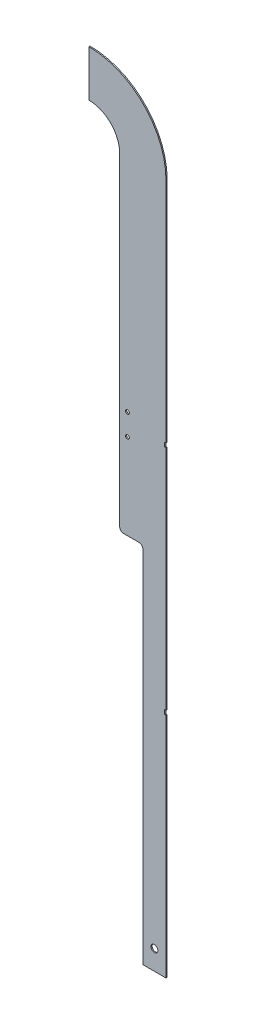
ISO-10303-21;
HEADER;
FILE_DESCRIPTION(('STEP AP214'),'2;1');
FILE_NAME('part.step','',(''),(''),'','','');
FILE_SCHEMA(('AUTOMOTIVE_DESIGN { 1 0 10303 214 1 1 1 1 }'));
ENDSEC;
DATA;
#1=APPLICATION_CONTEXT('core data for automotive mechanical design processes');
#2=APPLICATION_PROTOCOL_DEFINITION('international standard','automotive_design',2000,#1);
#3=PRODUCT_CONTEXT('',#1,'mechanical');
#4=PRODUCT('Part','Part','',(#3));
#5=PRODUCT_RELATED_PRODUCT_CATEGORY('part','',(#4));
#6=PRODUCT_DEFINITION_FORMATION('','',#4);
#7=PRODUCT_DEFINITION_CONTEXT('part definition',#1,'design');
#8=PRODUCT_DEFINITION('design','',#6,#7);
#9=PRODUCT_DEFINITION_SHAPE('','',#8);
#10=(LENGTH_UNIT() NAMED_UNIT(*) SI_UNIT(.MILLI.,.METRE.));
#11=(NAMED_UNIT(*) PLANE_ANGLE_UNIT() SI_UNIT($,.RADIAN.));
#12=(NAMED_UNIT(*) SI_UNIT($,.STERADIAN.) SOLID_ANGLE_UNIT());
#13=UNCERTAINTY_MEASURE_WITH_UNIT(LENGTH_MEASURE(1.E-05),#10,'distance_accuracy_value','');
#14=(GEOMETRIC_REPRESENTATION_CONTEXT(3) GLOBAL_UNCERTAINTY_ASSIGNED_CONTEXT((#13)) GLOBAL_UNIT_ASSIGNED_CONTEXT((#10,
#11,#12)) REPRESENTATION_CONTEXT('',''));
#15=CARTESIAN_POINT('',(0.,0.,0.));
#16=DIRECTION('',(0.,0.,1.));
#17=DIRECTION('',(1.,0.,0.));
#18=AXIS2_PLACEMENT_3D('',#15,#16,#17);
#19=CARTESIAN_POINT('',(265.75,440.,1.5));
#20=DIRECTION('',(0.,0.,1.));
#21=DIRECTION('',(1.,0.,0.));
#22=AXIS2_PLACEMENT_3D('',#19,#20,#21);
#23=PLANE('',#22);
#24=CARTESIAN_POINT('',(350.75,-470.,1.5));
#25=DIRECTION('',(0.,0.,-1.));
#26=DIRECTION('',(-1.,0.,0.));
#27=AXIS2_PLACEMENT_3D('',#24,#25,#26);
#28=CIRCLE('',#27,4.5);
#29=CARTESIAN_POINT('',(346.25,-470.,1.5));
#30=VERTEX_POINT('',#29);
#31=EDGE_CURVE('E283',#30,#30,#28,.T.);
#32=ORIENTED_EDGE('',*,*,#31,.T.);
#33=EDGE_LOOP('',(#32));
#34=FACE_BOUND('',#33,.T.);
#35=CARTESIAN_POINT('',(315.75,87.0000000000004,1.5));
#36=DIRECTION('',(0.,0.,-1.));
#37=DIRECTION('',(-1.,0.,0.));
#38=AXIS2_PLACEMENT_3D('',#35,#36,#37);
#39=CIRCLE('',#38,2.49999999999995);
#40=CARTESIAN_POINT('',(313.25,87.0000000000004,1.5));
#41=VERTEX_POINT('',#40);
#42=EDGE_CURVE('E268',#41,#41,#39,.T.);
#43=ORIENTED_EDGE('',*,*,#42,.T.);
#44=EDGE_LOOP('',(#43));
#45=FACE_BOUND('',#44,.T.);
#46=CARTESIAN_POINT('',(315.75,115.,1.5));
#47=DIRECTION('',(0.,0.,-1.));
#48=DIRECTION('',(-1.,0.,0.));
#49=AXIS2_PLACEMENT_3D('',#46,#47,#48);
#50=CIRCLE('',#49,2.49999999999995);
#51=CARTESIAN_POINT('',(313.25,115.,1.5));
#52=VERTEX_POINT('',#51);
#53=EDGE_CURVE('E252',#52,#52,#50,.T.);
#54=ORIENTED_EDGE('',*,*,#53,.T.);
#55=EDGE_LOOP('',(#54));
#56=FACE_BOUND('',#55,.T.);
#57=DIRECTION('',(0.,-1.,0.));
#58=VECTOR('',#57,1.);
#59=CARTESIAN_POINT('',(364.05,105.033333333333,1.5));
#60=LINE('',#59,#58);
#61=CARTESIAN_POINT('',(364.05,105.033333333333,1.5));
#62=VERTEX_POINT('',#61);
#63=CARTESIAN_POINT('',(364.05,99.6333333333334,1.5));
#64=VERTEX_POINT('',#63);
#65=EDGE_CURVE('E213',#62,#64,#60,.T.);
#66=ORIENTED_EDGE('',*,*,#65,.F.);
#67=DIRECTION('',(-1.,0.,0.));
#68=VECTOR('',#67,1.);
#69=CARTESIAN_POINT('',(365.95,105.033333333333,1.5));
#70=LINE('',#69,#68);
#71=CARTESIAN_POINT('',(365.75,105.033333333333,1.5));
#72=VERTEX_POINT('',#71);
#73=EDGE_CURVE('E198',#72,#62,#70,.T.);
#74=ORIENTED_EDGE('',*,*,#73,.F.);
#75=DIRECTION('',(0.,1.,0.));
#76=VECTOR('',#75,1.);
#77=CARTESIAN_POINT('',(365.75,500.,1.5));
#78=LINE('',#77,#76);
#79=CARTESIAN_POINT('',(365.75,400.,1.5));
#80=VERTEX_POINT('',#79);
#81=EDGE_CURVE('E263',#72,#80,#78,.T.);
#82=ORIENTED_EDGE('',*,*,#81,.T.);
#83=CARTESIAN_POINT('',(265.75,400.,1.5));
#84=DIRECTION('',(0.,0.,1.));
#85=DIRECTION('',(1.,0.,0.));
#86=AXIS2_PLACEMENT_3D('',#83,#84,#85);
#87=CIRCLE('',#86,100.);
#88=CARTESIAN_POINT('',(265.75,500.,1.5));
#89=VERTEX_POINT('',#88);
#90=EDGE_CURVE('E256',#89,#80,#87,.F.);
#91=ORIENTED_EDGE('',*,*,#90,.F.);
#92=DIRECTION('',(0.,-1.,0.));
#93=VECTOR('',#92,1.);
#94=CARTESIAN_POINT('',(265.75,440.,1.5));
#95=LINE('',#94,#93);
#96=CARTESIAN_POINT('',(265.75,440.,1.5));
#97=VERTEX_POINT('',#96);
#98=EDGE_CURVE('E339',#89,#97,#95,.T.);
#99=ORIENTED_EDGE('',*,*,#98,.T.);
#100=CARTESIAN_POINT('',(265.75,400.,1.5));
#101=DIRECTION('',(0.,0.,-1.));
#102=DIRECTION('',(-1.,0.,0.));
#103=AXIS2_PLACEMENT_3D('',#100,#101,#102);
#104=CIRCLE('',#103,40.);
#105=CARTESIAN_POINT('',(305.75,400.,1.5));
#106=VERTEX_POINT('',#105);
#107=EDGE_CURVE('E274',#97,#106,#104,.T.);
#108=ORIENTED_EDGE('',*,*,#107,.T.);
#109=DIRECTION('',(0.,1.,0.));
#110=VECTOR('',#109,1.);
#111=CARTESIAN_POINT('',(305.75,400.,1.5));
#112=LINE('',#111,#110);
#113=CARTESIAN_POINT('',(305.75,-18.9999999999998,1.5));
#114=VERTEX_POINT('',#113);
#115=EDGE_CURVE('E281',#106,#114,#112,.F.);
#116=ORIENTED_EDGE('',*,*,#115,.T.);
#117=CARTESIAN_POINT('',(310.75,-18.9999999999998,1.5));
#118=DIRECTION('',(0.,0.,-1.));
#119=DIRECTION('',(-1.,0.,0.));
#120=AXIS2_PLACEMENT_3D('',#117,#118,#119);
#121=CIRCLE('',#120,5.);
#122=CARTESIAN_POINT('',(310.75,-23.9999999999998,1.5));
#123=VERTEX_POINT('',#122);
#124=EDGE_CURVE('E278',#123,#114,#121,.T.);
#125=ORIENTED_EDGE('',*,*,#124,.F.);
#126=DIRECTION('',(1.,0.,0.));
#127=VECTOR('',#126,1.);
#128=CARTESIAN_POINT('',(305.75,-23.9999999999998,1.5));
#129=LINE('',#128,#127);
#130=CARTESIAN_POINT('',(330.75,-23.9999999999998,1.5));
#131=VERTEX_POINT('',#130);
#132=EDGE_CURVE('E286',#123,#131,#129,.T.);
#133=ORIENTED_EDGE('',*,*,#132,.T.);
#134=CARTESIAN_POINT('',(330.75,-28.9999999999998,1.5));
#135=DIRECTION('',(0.,0.,1.));
#136=DIRECTION('',(1.,0.,0.));
#137=AXIS2_PLACEMENT_3D('',#134,#135,#136);
#138=CIRCLE('',#137,5.);
#139=CARTESIAN_POINT('',(335.75,-28.9999999999998,1.5));
#140=VERTEX_POINT('',#139);
#141=EDGE_CURVE('E271',#131,#140,#138,.F.);
#142=ORIENTED_EDGE('',*,*,#141,.T.);
#143=DIRECTION('',(0.,1.,0.));
#144=VECTOR('',#143,1.);
#145=CARTESIAN_POINT('',(335.75,-480.,1.5));
#146=LINE('',#145,#144);
#147=CARTESIAN_POINT('',(335.75,-495.5,1.5));
#148=VERTEX_POINT('',#147);
#149=EDGE_CURVE('E276',#140,#148,#146,.F.);
#150=ORIENTED_EDGE('',*,*,#149,.T.);
#151=DIRECTION('',(1.,0.,0.));
#152=VECTOR('',#151,1.);
#153=CARTESIAN_POINT('',(554.25,-495.5,1.5));
#154=LINE('',#153,#152);
#155=CARTESIAN_POINT('',(365.75,-495.5,1.5));
#156=VERTEX_POINT('',#155);
#157=EDGE_CURVE('E291',#148,#156,#154,.T.);
#158=ORIENTED_EDGE('',*,*,#157,.T.);
#159=CARTESIAN_POINT('',(365.75,-200.533333333333,1.5));
#160=VERTEX_POINT('',#159);
#161=EDGE_CURVE('E258',#156,#160,#78,.T.);
#162=ORIENTED_EDGE('',*,*,#161,.T.);
#163=DIRECTION('',(-1.,0.,0.));
#164=VECTOR('',#163,1.);
#165=CARTESIAN_POINT('',(365.95,-200.533333333333,1.5));
#166=LINE('',#165,#164);
#167=CARTESIAN_POINT('',(364.05,-200.533333333333,1.5));
#168=VERTEX_POINT('',#167);
#169=EDGE_CURVE('E72',#160,#168,#166,.T.);
#170=ORIENTED_EDGE('',*,*,#169,.T.);
#171=DIRECTION('',(0.,-1.,0.));
#172=VECTOR('',#171,1.);
#173=CARTESIAN_POINT('',(364.05,-195.133333333333,1.5));
#174=LINE('',#173,#172);
#175=CARTESIAN_POINT('',(364.05,-195.133333333333,1.5));
#176=VERTEX_POINT('',#175);
#177=EDGE_CURVE('E233',#176,#168,#174,.T.);
#178=ORIENTED_EDGE('',*,*,#177,.F.);
#179=DIRECTION('',(-1.,0.,0.));
#180=VECTOR('',#179,1.);
#181=CARTESIAN_POINT('',(365.95,-195.133333333333,1.5));
#182=LINE('',#181,#180);
#183=CARTESIAN_POINT('',(365.75,-195.133333333333,1.5));
#184=VERTEX_POINT('',#183);
#185=EDGE_CURVE('E217',#184,#176,#182,.T.);
#186=ORIENTED_EDGE('',*,*,#185,.F.);
#187=CARTESIAN_POINT('',(365.75,99.6333333333335,1.5));
#188=VERTEX_POINT('',#187);
#189=EDGE_CURVE('E262',#184,#188,#78,.T.);
#190=ORIENTED_EDGE('',*,*,#189,.T.);
#191=DIRECTION('',(-1.,0.,0.));
#192=VECTOR('',#191,1.);
#193=CARTESIAN_POINT('',(365.95,99.6333333333334,1.5));
#194=LINE('',#193,#192);
#195=EDGE_CURVE('E60',#188,#64,#194,.T.);
#196=ORIENTED_EDGE('',*,*,#195,.T.);
#197=EDGE_LOOP('',(#66,#74,#82,#91,#99,#108,#116,#125,#133,#142,#150,#158,#162,#170,#178,#186,
#190,#196));
#198=FACE_BOUND('',#197,.T.);
#199=ADVANCED_FACE('F42',(#34,#45,#56,#198),#23,.T.);
#200=CARTESIAN_POINT('',(0.,0.,0.));
#201=DIRECTION('',(0.,0.,1.));
#202=DIRECTION('',(1.,0.,0.));
#203=AXIS2_PLACEMENT_3D('',#200,#201,#202);
#204=PLANE('',#203);
#205=CARTESIAN_POINT('',(350.75,-470.,0.));
#206=DIRECTION('',(0.,0.,-1.));
#207=DIRECTION('',(-1.,0.,0.));
#208=AXIS2_PLACEMENT_3D('',#205,#206,#207);
#209=CIRCLE('',#208,4.5);
#210=CARTESIAN_POINT('',(346.25,-470.,0.));
#211=VERTEX_POINT('',#210);
#212=EDGE_CURVE('E304',#211,#211,#209,.T.);
#213=ORIENTED_EDGE('',*,*,#212,.F.);
#214=EDGE_LOOP('',(#213));
#215=FACE_BOUND('',#214,.T.);
#216=CARTESIAN_POINT('',(315.75,87.0000000000004,0.));
#217=DIRECTION('',(0.,0.,-1.));
#218=DIRECTION('',(-1.,0.,0.));
#219=AXIS2_PLACEMENT_3D('',#216,#217,#218);
#220=CIRCLE('',#219,2.49999999999995);
#221=CARTESIAN_POINT('',(313.25,87.0000000000004,0.));
#222=VERTEX_POINT('',#221);
#223=EDGE_CURVE('E292',#222,#222,#220,.T.);
#224=ORIENTED_EDGE('',*,*,#223,.F.);
#225=EDGE_LOOP('',(#224));
#226=FACE_BOUND('',#225,.T.);
#227=CARTESIAN_POINT('',(315.75,115.,0.));
#228=DIRECTION('',(0.,0.,-1.));
#229=DIRECTION('',(-1.,0.,0.));
#230=AXIS2_PLACEMENT_3D('',#227,#228,#229);
#231=CIRCLE('',#230,2.49999999999995);
#232=CARTESIAN_POINT('',(313.25,115.,0.));
#233=VERTEX_POINT('',#232);
#234=EDGE_CURVE('E288',#233,#233,#231,.T.);
#235=ORIENTED_EDGE('',*,*,#234,.F.);
#236=EDGE_LOOP('',(#235));
#237=FACE_BOUND('',#236,.T.);
#238=DIRECTION('',(-1.,0.,0.));
#239=VECTOR('',#238,1.);
#240=CARTESIAN_POINT('',(365.95,105.033333333333,0.));
#241=LINE('',#240,#239);
#242=CARTESIAN_POINT('',(365.75,105.033333333333,0.));
#243=VERTEX_POINT('',#242);
#244=CARTESIAN_POINT('',(364.05,105.033333333333,0.));
#245=VERTEX_POINT('',#244);
#246=EDGE_CURVE('E225',#243,#245,#241,.T.);
#247=ORIENTED_EDGE('',*,*,#246,.T.);
#248=DIRECTION('',(0.,1.,0.));
#249=VECTOR('',#248,1.);
#250=CARTESIAN_POINT('',(364.05,105.033333333333,0.));
#251=LINE('',#250,#249);
#252=CARTESIAN_POINT('',(364.05,99.6333333333334,0.));
#253=VERTEX_POINT('',#252);
#254=EDGE_CURVE('E215',#253,#245,#251,.T.);
#255=ORIENTED_EDGE('',*,*,#254,.F.);
#256=DIRECTION('',(-1.,0.,0.));
#257=VECTOR('',#256,1.);
#258=CARTESIAN_POINT('',(365.95,99.6333333333334,0.));
#259=LINE('',#258,#257);
#260=CARTESIAN_POINT('',(365.75,99.6333333333334,0.));
#261=VERTEX_POINT('',#260);
#262=EDGE_CURVE('E227',#261,#253,#259,.T.);
#263=ORIENTED_EDGE('',*,*,#262,.F.);
#264=DIRECTION('',(0.,-1.,0.));
#265=VECTOR('',#264,1.);
#266=CARTESIAN_POINT('',(365.75,500.,0.));
#267=LINE('',#266,#265);
#268=CARTESIAN_POINT('',(365.75,-195.133333333333,0.));
#269=VERTEX_POINT('',#268);
#270=EDGE_CURVE('E333',#261,#269,#267,.T.);
#271=ORIENTED_EDGE('',*,*,#270,.T.);
#272=DIRECTION('',(-1.,0.,0.));
#273=VECTOR('',#272,1.);
#274=CARTESIAN_POINT('',(365.95,-195.133333333333,0.));
#275=LINE('',#274,#273);
#276=CARTESIAN_POINT('',(364.05,-195.133333333333,0.));
#277=VERTEX_POINT('',#276);
#278=EDGE_CURVE('E242',#269,#277,#275,.T.);
#279=ORIENTED_EDGE('',*,*,#278,.T.);
#280=DIRECTION('',(0.,1.,0.));
#281=VECTOR('',#280,1.);
#282=CARTESIAN_POINT('',(364.05,-195.133333333333,0.));
#283=LINE('',#282,#281);
#284=CARTESIAN_POINT('',(364.05,-200.533333333333,0.));
#285=VERTEX_POINT('',#284);
#286=EDGE_CURVE('E239',#285,#277,#283,.T.);
#287=ORIENTED_EDGE('',*,*,#286,.F.);
#288=DIRECTION('',(-1.,0.,0.));
#289=VECTOR('',#288,1.);
#290=CARTESIAN_POINT('',(365.95,-200.533333333333,0.));
#291=LINE('',#290,#289);
#292=CARTESIAN_POINT('',(365.75,-200.533333333333,0.));
#293=VERTEX_POINT('',#292);
#294=EDGE_CURVE('E245',#293,#285,#291,.T.);
#295=ORIENTED_EDGE('',*,*,#294,.F.);
#296=CARTESIAN_POINT('',(365.75,-495.5,0.));
#297=VERTEX_POINT('',#296);
#298=EDGE_CURVE('E336',#293,#297,#267,.T.);
#299=ORIENTED_EDGE('',*,*,#298,.T.);
#300=DIRECTION('',(-1.,0.,0.));
#301=VECTOR('',#300,1.);
#302=CARTESIAN_POINT('',(0.,-495.5,0.));
#303=LINE('',#302,#301);
#304=CARTESIAN_POINT('',(335.75,-495.5,0.));
#305=VERTEX_POINT('',#304);
#306=EDGE_CURVE('E257',#297,#305,#303,.T.);
#307=ORIENTED_EDGE('',*,*,#306,.T.);
#308=DIRECTION('',(0.,1.,0.));
#309=VECTOR('',#308,1.);
#310=CARTESIAN_POINT('',(335.75,0.,0.));
#311=LINE('',#310,#309);
#312=CARTESIAN_POINT('',(335.75,-28.9999999999998,0.));
#313=VERTEX_POINT('',#312);
#314=EDGE_CURVE('E297',#313,#305,#311,.F.);
#315=ORIENTED_EDGE('',*,*,#314,.F.);
#316=CARTESIAN_POINT('',(330.75,-28.9999999999998,0.));
#317=DIRECTION('',(0.,0.,1.));
#318=DIRECTION('',(1.,0.,0.));
#319=AXIS2_PLACEMENT_3D('',#316,#317,#318);
#320=CIRCLE('',#319,5.);
#321=CARTESIAN_POINT('',(330.75,-23.9999999999998,0.));
#322=VERTEX_POINT('',#321);
#323=EDGE_CURVE('E295',#322,#313,#320,.F.);
#324=ORIENTED_EDGE('',*,*,#323,.F.);
#325=DIRECTION('',(1.,0.,0.));
#326=VECTOR('',#325,1.);
#327=CARTESIAN_POINT('',(0.,-23.9999999999998,0.));
#328=LINE('',#327,#326);
#329=CARTESIAN_POINT('',(310.75,-23.9999999999998,0.));
#330=VERTEX_POINT('',#329);
#331=EDGE_CURVE('E303',#330,#322,#328,.T.);
#332=ORIENTED_EDGE('',*,*,#331,.F.);
#333=CARTESIAN_POINT('',(310.75,-18.9999999999998,0.));
#334=DIRECTION('',(0.,0.,-1.));
#335=DIRECTION('',(-1.,0.,0.));
#336=AXIS2_PLACEMENT_3D('',#333,#334,#335);
#337=CIRCLE('',#336,5.);
#338=CARTESIAN_POINT('',(305.75,-18.9999999999998,0.));
#339=VERTEX_POINT('',#338);
#340=EDGE_CURVE('E301',#339,#330,#337,.F.);
#341=ORIENTED_EDGE('',*,*,#340,.F.);
#342=DIRECTION('',(0.,1.,0.));
#343=VECTOR('',#342,1.);
#344=CARTESIAN_POINT('',(305.75,0.,0.));
#345=LINE('',#344,#343);
#346=CARTESIAN_POINT('',(305.75,400.,0.));
#347=VERTEX_POINT('',#346);
#348=EDGE_CURVE('E300',#347,#339,#345,.F.);
#349=ORIENTED_EDGE('',*,*,#348,.F.);
#350=CARTESIAN_POINT('',(265.75,400.,0.));
#351=DIRECTION('',(0.,0.,-1.));
#352=DIRECTION('',(-1.,0.,0.));
#353=AXIS2_PLACEMENT_3D('',#350,#351,#352);
#354=CIRCLE('',#353,40.);
#355=CARTESIAN_POINT('',(265.75,440.,0.));
#356=VERTEX_POINT('',#355);
#357=EDGE_CURVE('E298',#356,#347,#354,.T.);
#358=ORIENTED_EDGE('',*,*,#357,.F.);
#359=DIRECTION('',(0.,-1.,0.));
#360=VECTOR('',#359,1.);
#361=CARTESIAN_POINT('',(265.75,0.,0.));
#362=LINE('',#361,#360);
#363=CARTESIAN_POINT('',(265.75,500.,0.));
#364=VERTEX_POINT('',#363);
#365=EDGE_CURVE('E379',#364,#356,#362,.T.);
#366=ORIENTED_EDGE('',*,*,#365,.F.);
#367=CARTESIAN_POINT('',(265.75,400.,0.));
#368=DIRECTION('',(0.,0.,-1.));
#369=DIRECTION('',(-1.,0.,0.));
#370=AXIS2_PLACEMENT_3D('',#367,#368,#369);
#371=CIRCLE('',#370,100.);
#372=CARTESIAN_POINT('',(365.75,400.,0.));
#373=VERTEX_POINT('',#372);
#374=EDGE_CURVE('E371',#373,#364,#371,.F.);
#375=ORIENTED_EDGE('',*,*,#374,.F.);
#376=EDGE_CURVE('E307',#373,#243,#267,.T.);
#377=ORIENTED_EDGE('',*,*,#376,.T.);
#378=EDGE_LOOP('',(#247,#255,#263,#271,#279,#287,#295,#299,#307,#315,#324,#332,#341,#349,#358,
#366,#375,#377));
#379=FACE_BOUND('',#378,.T.);
#380=ADVANCED_FACE('F348',(#215,#226,#237,#379),#204,.F.);
#381=CARTESIAN_POINT('',(365.75,500.,50.));
#382=DIRECTION('',(-1.,0.,0.));
#383=DIRECTION('',(0.,-1.,0.));
#384=AXIS2_PLACEMENT_3D('',#381,#382,#383);
#385=PLANE('',#384);
#386=DIRECTION('',(0.,0.,1.));
#387=VECTOR('',#386,1.);
#388=CARTESIAN_POINT('',(365.75,105.033333333333,50.));
#389=LINE('',#388,#387);
#390=EDGE_CURVE('E11',#243,#72,#389,.T.);
#391=ORIENTED_EDGE('',*,*,#390,.F.);
#392=ORIENTED_EDGE('',*,*,#376,.F.);
#393=DIRECTION('',(0.,0.,-1.));
#394=VECTOR('',#393,1.);
#395=CARTESIAN_POINT('',(365.75,400.,50.));
#396=LINE('',#395,#394);
#397=EDGE_CURVE('E249',#80,#373,#396,.T.);
#398=ORIENTED_EDGE('',*,*,#397,.F.);
#399=ORIENTED_EDGE('',*,*,#81,.F.);
#400=EDGE_LOOP('',(#391,#392,#398,#399));
#401=FACE_BOUND('',#400,.T.);
#402=ADVANCED_FACE('F421',(#401),#385,.F.);
#403=DIRECTION('',(0.,0.,-1.));
#404=VECTOR('',#403,1.);
#405=CARTESIAN_POINT('',(365.75,99.6333333333335,50.));
#406=LINE('',#405,#404);
#407=EDGE_CURVE('E49',#188,#261,#406,.T.);
#408=ORIENTED_EDGE('',*,*,#407,.F.);
#409=ORIENTED_EDGE('',*,*,#189,.F.);
#410=DIRECTION('',(0.,0.,1.));
#411=VECTOR('',#410,1.);
#412=CARTESIAN_POINT('',(365.75,-195.133333333333,50.));
#413=LINE('',#412,#411);
#414=EDGE_CURVE('E341',#269,#184,#413,.T.);
#415=ORIENTED_EDGE('',*,*,#414,.F.);
#416=ORIENTED_EDGE('',*,*,#270,.F.);
#417=EDGE_LOOP('',(#408,#409,#415,#416));
#418=FACE_BOUND('',#417,.T.);
#419=ADVANCED_FACE('F350',(#418),#385,.F.);
#420=DIRECTION('',(0.,0.,-1.));
#421=VECTOR('',#420,1.);
#422=CARTESIAN_POINT('',(365.75,-200.533333333333,50.));
#423=LINE('',#422,#421);
#424=EDGE_CURVE('E261',#160,#293,#423,.T.);
#425=ORIENTED_EDGE('',*,*,#424,.F.);
#426=ORIENTED_EDGE('',*,*,#161,.F.);
#427=DIRECTION('',(0.,0.,-1.));
#428=VECTOR('',#427,1.);
#429=CARTESIAN_POINT('',(365.75,-495.5,50.));
#430=LINE('',#429,#428);
#431=EDGE_CURVE('E253',#156,#297,#430,.T.);
#432=ORIENTED_EDGE('',*,*,#431,.T.);
#433=ORIENTED_EDGE('',*,*,#298,.F.);
#434=EDGE_LOOP('',(#425,#426,#432,#433));
#435=FACE_BOUND('',#434,.T.);
#436=ADVANCED_FACE('F361',(#435),#385,.F.);
#437=CARTESIAN_POINT('',(265.75,440.,1.51010307764118));
#438=DIRECTION('',(-1.,0.,0.));
#439=DIRECTION('',(0.,0.,1.));
#440=AXIS2_PLACEMENT_3D('',#437,#438,#439);
#441=PLANE('',#440);
#442=ORIENTED_EDGE('',*,*,#98,.F.);
#443=DIRECTION('',(0.,0.,-1.));
#444=VECTOR('',#443,1.);
#445=CARTESIAN_POINT('',(265.75,500.,50.));
#446=LINE('',#445,#444);
#447=EDGE_CURVE('E251',#364,#89,#446,.F.);
#448=ORIENTED_EDGE('',*,*,#447,.F.);
#449=ORIENTED_EDGE('',*,*,#365,.T.);
#450=DIRECTION('',(0.,0.,-1.));
#451=VECTOR('',#450,1.);
#452=CARTESIAN_POINT('',(265.75,440.,1.5));
#453=LINE('',#452,#451);
#454=EDGE_CURVE('E207',#356,#97,#453,.F.);
#455=ORIENTED_EDGE('',*,*,#454,.T.);
#456=EDGE_LOOP('',(#442,#448,#449,#455));
#457=FACE_BOUND('',#456,.T.);
#458=ADVANCED_FACE('F386',(#457),#441,.T.);
#459=CARTESIAN_POINT('',(265.75,400.,50.));
#460=DIRECTION('',(0.,0.,-1.));
#461=DIRECTION('',(-1.,0.,0.));
#462=AXIS2_PLACEMENT_3D('',#459,#460,#461);
#463=CYLINDRICAL_SURFACE('',#462,100.);
#464=ORIENTED_EDGE('',*,*,#447,.T.);
#465=ORIENTED_EDGE('',*,*,#90,.T.);
#466=ORIENTED_EDGE('',*,*,#397,.T.);
#467=ORIENTED_EDGE('',*,*,#374,.T.);
#468=EDGE_LOOP('',(#464,#465,#466,#467));
#469=FACE_BOUND('',#468,.T.);
#470=ADVANCED_FACE('F418',(#469),#463,.T.);
#471=CARTESIAN_POINT('',(265.75,400.,1.5));
#472=DIRECTION('',(0.,0.,-1.));
#473=DIRECTION('',(-1.,0.,0.));
#474=AXIS2_PLACEMENT_3D('',#471,#472,#473);
#475=CYLINDRICAL_SURFACE('',#474,40.);
#476=DIRECTION('',(0.,0.,1.));
#477=VECTOR('',#476,1.);
#478=CARTESIAN_POINT('',(305.75,400.,1.5));
#479=LINE('',#478,#477);
#480=EDGE_CURVE('E277',#347,#106,#479,.T.);
#481=ORIENTED_EDGE('',*,*,#480,.T.);
#482=ORIENTED_EDGE('',*,*,#107,.F.);
#483=ORIENTED_EDGE('',*,*,#454,.F.);
#484=ORIENTED_EDGE('',*,*,#357,.T.);
#485=EDGE_LOOP('',(#481,#482,#483,#484));
#486=FACE_BOUND('',#485,.T.);
#487=ADVANCED_FACE('F389',(#486),#475,.F.);
#488=CARTESIAN_POINT('',(305.75,400.,1.5));
#489=DIRECTION('',(1.,0.,0.));
#490=DIRECTION('',(0.,1.,0.));
#491=AXIS2_PLACEMENT_3D('',#488,#489,#490);
#492=PLANE('',#491);
#493=DIRECTION('',(0.,0.,-1.));
#494=VECTOR('',#493,1.);
#495=CARTESIAN_POINT('',(305.75,-18.9999999999998,50.001));
#496=LINE('',#495,#494);
#497=EDGE_CURVE('E282',#114,#339,#496,.T.);
#498=ORIENTED_EDGE('',*,*,#497,.F.);
#499=ORIENTED_EDGE('',*,*,#115,.F.);
#500=ORIENTED_EDGE('',*,*,#480,.F.);
#501=ORIENTED_EDGE('',*,*,#348,.T.);
#502=EDGE_LOOP('',(#498,#499,#500,#501));
#503=FACE_BOUND('',#502,.T.);
#504=ADVANCED_FACE('F395',(#503),#492,.F.);
#505=CARTESIAN_POINT('',(310.75,-18.9999999999998,50.001));
#506=DIRECTION('',(0.,0.,-1.));
#507=DIRECTION('',(-1.,0.,0.));
#508=AXIS2_PLACEMENT_3D('',#505,#506,#507);
#509=CYLINDRICAL_SURFACE('',#508,5.);
#510=ORIENTED_EDGE('',*,*,#340,.T.);
#511=DIRECTION('',(0.,0.,1.));
#512=VECTOR('',#511,1.);
#513=CARTESIAN_POINT('',(310.75,-23.9999999999998,50.001));
#514=LINE('',#513,#512);
#515=EDGE_CURVE('E311',#330,#123,#514,.T.);
#516=ORIENTED_EDGE('',*,*,#515,.T.);
#517=ORIENTED_EDGE('',*,*,#124,.T.);
#518=ORIENTED_EDGE('',*,*,#497,.T.);
#519=EDGE_LOOP('',(#510,#516,#517,#518));
#520=FACE_BOUND('',#519,.T.);
#521=ADVANCED_FACE('F400',(#520),#509,.T.);
#522=CARTESIAN_POINT('',(305.75,-23.9999999999998,50.001));
#523=DIRECTION('',(0.,1.,0.));
#524=DIRECTION('',(0.,0.,1.));
#525=AXIS2_PLACEMENT_3D('',#522,#523,#524);
#526=PLANE('',#525);
#527=ORIENTED_EDGE('',*,*,#515,.F.);
#528=ORIENTED_EDGE('',*,*,#331,.T.);
#529=DIRECTION('',(0.,0.,1.));
#530=VECTOR('',#529,1.);
#531=CARTESIAN_POINT('',(330.75,-23.9999999999998,50.001));
#532=LINE('',#531,#530);
#533=EDGE_CURVE('E322',#131,#322,#532,.F.);
#534=ORIENTED_EDGE('',*,*,#533,.F.);
#535=ORIENTED_EDGE('',*,*,#132,.F.);
#536=EDGE_LOOP('',(#527,#528,#534,#535));
#537=FACE_BOUND('',#536,.T.);
#538=ADVANCED_FACE('F405',(#537),#526,.F.);
#539=CARTESIAN_POINT('',(330.75,-28.9999999999998,50.001));
#540=DIRECTION('',(0.,0.,1.));
#541=DIRECTION('',(1.,0.,0.));
#542=AXIS2_PLACEMENT_3D('',#539,#540,#541);
#543=CYLINDRICAL_SURFACE('',#542,5.);
#544=ORIENTED_EDGE('',*,*,#533,.T.);
#545=ORIENTED_EDGE('',*,*,#323,.T.);
#546=DIRECTION('',(0.,0.,-1.));
#547=VECTOR('',#546,1.);
#548=CARTESIAN_POINT('',(335.75,-28.9999999999998,50.001));
#549=LINE('',#548,#547);
#550=EDGE_CURVE('E273',#313,#140,#549,.F.);
#551=ORIENTED_EDGE('',*,*,#550,.T.);
#552=ORIENTED_EDGE('',*,*,#141,.F.);
#553=EDGE_LOOP('',(#544,#545,#551,#552));
#554=FACE_BOUND('',#553,.T.);
#555=ADVANCED_FACE('F408',(#554),#543,.F.);
#556=CARTESIAN_POINT('',(315.75,115.,0.));
#557=DIRECTION('',(0.,0.,-1.));
#558=DIRECTION('',(-1.,0.,0.));
#559=AXIS2_PLACEMENT_3D('',#556,#557,#558);
#560=CYLINDRICAL_SURFACE('',#559,2.49999999999995);
#561=ORIENTED_EDGE('',*,*,#53,.F.);
#562=EDGE_LOOP('',(#561));
#563=FACE_BOUND('',#562,.T.);
#564=ORIENTED_EDGE('',*,*,#234,.T.);
#565=EDGE_LOOP('',(#564));
#566=FACE_BOUND('',#565,.T.);
#567=ADVANCED_FACE('F442',(#563,#566),#560,.F.);
#568=CARTESIAN_POINT('',(315.75,87.0000000000004,0.));
#569=DIRECTION('',(0.,0.,-1.));
#570=DIRECTION('',(-1.,0.,0.));
#571=AXIS2_PLACEMENT_3D('',#568,#569,#570);
#572=CYLINDRICAL_SURFACE('',#571,2.49999999999995);
#573=ORIENTED_EDGE('',*,*,#42,.F.);
#574=EDGE_LOOP('',(#573));
#575=FACE_BOUND('',#574,.T.);
#576=ORIENTED_EDGE('',*,*,#223,.T.);
#577=EDGE_LOOP('',(#576));
#578=FACE_BOUND('',#577,.T.);
#579=ADVANCED_FACE('F445',(#575,#578),#572,.F.);
#580=CARTESIAN_POINT('',(335.75,-480.,50.001));
#581=DIRECTION('',(1.,0.,0.));
#582=DIRECTION('',(0.,0.,-1.));
#583=AXIS2_PLACEMENT_3D('',#580,#581,#582);
#584=PLANE('',#583);
#585=ORIENTED_EDGE('',*,*,#550,.F.);
#586=ORIENTED_EDGE('',*,*,#314,.T.);
#587=DIRECTION('',(0.,0.,-1.));
#588=VECTOR('',#587,1.);
#589=CARTESIAN_POINT('',(335.75,-495.5,3.));
#590=LINE('',#589,#588);
#591=EDGE_CURVE('E287',#305,#148,#590,.F.);
#592=ORIENTED_EDGE('',*,*,#591,.T.);
#593=ORIENTED_EDGE('',*,*,#149,.F.);
#594=EDGE_LOOP('',(#585,#586,#592,#593));
#595=FACE_BOUND('',#594,.T.);
#596=ADVANCED_FACE('F412',(#595),#584,.F.);
#597=CARTESIAN_POINT('',(335.75,-495.5,1.5));
#598=DIRECTION('',(0.,1.,0.));
#599=DIRECTION('',(0.,0.,1.));
#600=AXIS2_PLACEMENT_3D('',#597,#598,#599);
#601=PLANE('',#600);
#602=ORIENTED_EDGE('',*,*,#431,.F.);
#603=ORIENTED_EDGE('',*,*,#157,.F.);
#604=ORIENTED_EDGE('',*,*,#591,.F.);
#605=ORIENTED_EDGE('',*,*,#306,.F.);
#606=EDGE_LOOP('',(#602,#603,#604,#605));
#607=FACE_BOUND('',#606,.T.);
#608=ADVANCED_FACE('F368',(#607),#601,.F.);
#609=CARTESIAN_POINT('',(350.75,-470.,0.));
#610=DIRECTION('',(0.,0.,-1.));
#611=DIRECTION('',(-1.,0.,0.));
#612=AXIS2_PLACEMENT_3D('',#609,#610,#611);
#613=CYLINDRICAL_SURFACE('',#612,4.5);
#614=ORIENTED_EDGE('',*,*,#31,.F.);
#615=EDGE_LOOP('',(#614));
#616=FACE_BOUND('',#615,.T.);
#617=ORIENTED_EDGE('',*,*,#212,.T.);
#618=EDGE_LOOP('',(#617));
#619=FACE_BOUND('',#618,.T.);
#620=ADVANCED_FACE('F467',(#616,#619),#613,.F.);
#621=CARTESIAN_POINT('',(365.95,-195.133333333333,1.5));
#622=DIRECTION('',(0.,-1.,0.));
#623=DIRECTION('',(1.,0.,0.));
#624=AXIS2_PLACEMENT_3D('',#621,#622,#623);
#625=PLANE('',#624);
#626=ORIENTED_EDGE('',*,*,#414,.T.);
#627=ORIENTED_EDGE('',*,*,#185,.T.);
#628=DIRECTION('',(0.,0.,1.));
#629=VECTOR('',#628,1.);
#630=CARTESIAN_POINT('',(364.05,-195.133333333333,1.5));
#631=LINE('',#630,#629);
#632=EDGE_CURVE('E230',#277,#176,#631,.T.);
#633=ORIENTED_EDGE('',*,*,#632,.F.);
#634=ORIENTED_EDGE('',*,*,#278,.F.);
#635=EDGE_LOOP('',(#626,#627,#633,#634));
#636=FACE_BOUND('',#635,.T.);
#637=ADVANCED_FACE('F353',(#636),#625,.T.);
#638=CARTESIAN_POINT('',(365.95,-200.533333333333,1.5));
#639=DIRECTION('',(0.,1.,0.));
#640=DIRECTION('',(-1.,0.,0.));
#641=AXIS2_PLACEMENT_3D('',#638,#639,#640);
#642=PLANE('',#641);
#643=ORIENTED_EDGE('',*,*,#424,.T.);
#644=ORIENTED_EDGE('',*,*,#294,.T.);
#645=DIRECTION('',(0.,0.,-1.));
#646=VECTOR('',#645,1.);
#647=CARTESIAN_POINT('',(364.05,-200.533333333333,1.5));
#648=LINE('',#647,#646);
#649=EDGE_CURVE('E236',#168,#285,#648,.T.);
#650=ORIENTED_EDGE('',*,*,#649,.F.);
#651=ORIENTED_EDGE('',*,*,#169,.F.);
#652=EDGE_LOOP('',(#643,#644,#650,#651));
#653=FACE_BOUND('',#652,.T.);
#654=ADVANCED_FACE('F478',(#653),#642,.T.);
#655=CARTESIAN_POINT('',(364.05,0.,0.));
#656=DIRECTION('',(-1.,0.,0.));
#657=DIRECTION('',(0.,0.,1.));
#658=AXIS2_PLACEMENT_3D('',#655,#656,#657);
#659=PLANE('',#658);
#660=ORIENTED_EDGE('',*,*,#632,.T.);
#661=ORIENTED_EDGE('',*,*,#177,.T.);
#662=ORIENTED_EDGE('',*,*,#649,.T.);
#663=ORIENTED_EDGE('',*,*,#286,.T.);
#664=EDGE_LOOP('',(#660,#661,#662,#663));
#665=FACE_BOUND('',#664,.T.);
#666=ADVANCED_FACE('F356',(#665),#659,.F.);
#667=CARTESIAN_POINT('',(365.95,105.033333333333,1.5));
#668=DIRECTION('',(0.,-1.,0.));
#669=DIRECTION('',(1.,0.,0.));
#670=AXIS2_PLACEMENT_3D('',#667,#668,#669);
#671=PLANE('',#670);
#672=ORIENTED_EDGE('',*,*,#390,.T.);
#673=ORIENTED_EDGE('',*,*,#73,.T.);
#674=DIRECTION('',(0.,0.,1.));
#675=VECTOR('',#674,1.);
#676=CARTESIAN_POINT('',(364.05,105.033333333333,1.5));
#677=LINE('',#676,#675);
#678=EDGE_CURVE('E201',#245,#62,#677,.T.);
#679=ORIENTED_EDGE('',*,*,#678,.F.);
#680=ORIENTED_EDGE('',*,*,#246,.F.);
#681=EDGE_LOOP('',(#672,#673,#679,#680));
#682=FACE_BOUND('',#681,.T.);
#683=ADVANCED_FACE('F200',(#682),#671,.T.);
#684=CARTESIAN_POINT('',(365.95,99.6333333333334,1.5));
#685=DIRECTION('',(0.,1.,0.));
#686=DIRECTION('',(-1.,0.,0.));
#687=AXIS2_PLACEMENT_3D('',#684,#685,#686);
#688=PLANE('',#687);
#689=ORIENTED_EDGE('',*,*,#407,.T.);
#690=ORIENTED_EDGE('',*,*,#262,.T.);
#691=DIRECTION('',(0.,0.,-1.));
#692=VECTOR('',#691,1.);
#693=CARTESIAN_POINT('',(364.05,99.6333333333334,1.5));
#694=LINE('',#693,#692);
#695=EDGE_CURVE('E220',#64,#253,#694,.T.);
#696=ORIENTED_EDGE('',*,*,#695,.F.);
#697=ORIENTED_EDGE('',*,*,#195,.F.);
#698=EDGE_LOOP('',(#689,#690,#696,#697));
#699=FACE_BOUND('',#698,.T.);
#700=ADVANCED_FACE('F343',(#699),#688,.T.);
#701=CARTESIAN_POINT('',(364.05,0.,0.));
#702=DIRECTION('',(-1.,0.,0.));
#703=DIRECTION('',(0.,0.,1.));
#704=AXIS2_PLACEMENT_3D('',#701,#702,#703);
#705=PLANE('',#704);
#706=ORIENTED_EDGE('',*,*,#678,.T.);
#707=ORIENTED_EDGE('',*,*,#65,.T.);
#708=ORIENTED_EDGE('',*,*,#695,.T.);
#709=ORIENTED_EDGE('',*,*,#254,.T.);
#710=EDGE_LOOP('',(#706,#707,#708,#709));
#711=FACE_BOUND('',#710,.T.);
#712=ADVANCED_FACE('F211',(#711),#705,.F.);
#713=CLOSED_SHELL('',(#199,#380,#402,#419,#436,#458,#470,#487,#504,#521,#538,#555,#567,#579,
#596,#608,#620,#637,#654,#666,#683,#700,#712));
#714=MANIFOLD_SOLID_BREP('B2',#713);
#715=ADVANCED_BREP_SHAPE_REPRESENTATION('',(#18,#714),#14);
#716=SHAPE_DEFINITION_REPRESENTATION(#9,#715);
ENDSEC;
END-ISO-10303-21;
